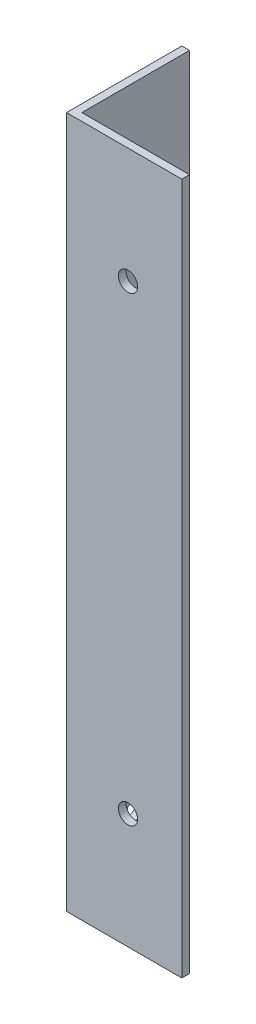
ISO-10303-21;
HEADER;
FILE_DESCRIPTION(('STEP AP214'),'2;1');
FILE_NAME('part.step','',(''),(''),'','','');
FILE_SCHEMA(('AUTOMOTIVE_DESIGN { 1 0 10303 214 1 1 1 1 }'));
ENDSEC;
DATA;
#1=APPLICATION_CONTEXT('core data for automotive mechanical design processes');
#2=APPLICATION_PROTOCOL_DEFINITION('international standard','automotive_design',2000,#1);
#3=PRODUCT_CONTEXT('',#1,'mechanical');
#4=PRODUCT('Part','Part','',(#3));
#5=PRODUCT_RELATED_PRODUCT_CATEGORY('part','',(#4));
#6=PRODUCT_DEFINITION_FORMATION('','',#4);
#7=PRODUCT_DEFINITION_CONTEXT('part definition',#1,'design');
#8=PRODUCT_DEFINITION('design','',#6,#7);
#9=PRODUCT_DEFINITION_SHAPE('','',#8);
#10=(LENGTH_UNIT() NAMED_UNIT(*) SI_UNIT(.MILLI.,.METRE.));
#11=(NAMED_UNIT(*) PLANE_ANGLE_UNIT() SI_UNIT($,.RADIAN.));
#12=(NAMED_UNIT(*) SI_UNIT($,.STERADIAN.) SOLID_ANGLE_UNIT());
#13=UNCERTAINTY_MEASURE_WITH_UNIT(LENGTH_MEASURE(1.E-05),#10,'distance_accuracy_value','');
#14=(GEOMETRIC_REPRESENTATION_CONTEXT(3) GLOBAL_UNCERTAINTY_ASSIGNED_CONTEXT((#13)) GLOBAL_UNIT_ASSIGNED_CONTEXT((#10,
#11,#12)) REPRESENTATION_CONTEXT('',''));
#15=CARTESIAN_POINT('',(0.,0.,0.));
#16=DIRECTION('',(0.,0.,1.));
#17=DIRECTION('',(1.,0.,0.));
#18=AXIS2_PLACEMENT_3D('',#15,#16,#17);
#19=CARTESIAN_POINT('',(0.,90.,0.));
#20=DIRECTION('',(0.,0.,1.));
#21=DIRECTION('',(1.,0.,0.));
#22=AXIS2_PLACEMENT_3D('',#19,#20,#21);
#23=PLANE('',#22);
#24=CARTESIAN_POINT('',(8.,15.,0.));
#25=DIRECTION('',(0.,0.,1.));
#26=DIRECTION('',(1.,0.,0.));
#27=AXIS2_PLACEMENT_3D('',#24,#25,#26);
#28=CIRCLE('',#27,1.24999999999999);
#29=CARTESIAN_POINT('',(9.24999999999999,15.,0.));
#30=VERTEX_POINT('',#29);
#31=EDGE_CURVE('E183',#30,#30,#28,.T.);
#32=ORIENTED_EDGE('',*,*,#31,.T.);
#33=EDGE_LOOP('',(#32));
#34=FACE_BOUND('',#33,.T.);
#35=CARTESIAN_POINT('',(8.,75.,0.));
#36=DIRECTION('',(0.,0.,1.));
#37=DIRECTION('',(1.,0.,0.));
#38=AXIS2_PLACEMENT_3D('',#35,#36,#37);
#39=CIRCLE('',#38,1.24999999999999);
#40=CARTESIAN_POINT('',(9.24999999999999,75.,0.));
#41=VERTEX_POINT('',#40);
#42=EDGE_CURVE('E118',#41,#41,#39,.T.);
#43=ORIENTED_EDGE('',*,*,#42,.T.);
#44=EDGE_LOOP('',(#43));
#45=FACE_BOUND('',#44,.T.);
#46=DIRECTION('',(0.,-1.,0.));
#47=VECTOR('',#46,1.);
#48=CARTESIAN_POINT('',(1.,90.,0.));
#49=LINE('',#48,#47);
#50=CARTESIAN_POINT('',(0.999999999999994,90.,0.));
#51=VERTEX_POINT('',#50);
#52=CARTESIAN_POINT('',(0.999999999999989,0.,0.));
#53=VERTEX_POINT('',#52);
#54=EDGE_CURVE('E49',#51,#53,#49,.T.);
#55=ORIENTED_EDGE('',*,*,#54,.F.);
#56=DIRECTION('',(-1.,0.,0.));
#57=VECTOR('',#56,1.);
#58=CARTESIAN_POINT('',(0.,90.,0.));
#59=LINE('',#58,#57);
#60=CARTESIAN_POINT('',(15.,90.,0.));
#61=VERTEX_POINT('',#60);
#62=EDGE_CURVE('E132',#61,#51,#59,.T.);
#63=ORIENTED_EDGE('',*,*,#62,.F.);
#64=DIRECTION('',(0.,-1.,0.));
#65=VECTOR('',#64,1.);
#66=CARTESIAN_POINT('',(15.,90.,0.));
#67=LINE('',#66,#65);
#68=CARTESIAN_POINT('',(15.,0.,0.));
#69=VERTEX_POINT('',#68);
#70=EDGE_CURVE('E134',#61,#69,#67,.T.);
#71=ORIENTED_EDGE('',*,*,#70,.T.);
#72=DIRECTION('',(-1.,0.,0.));
#73=VECTOR('',#72,1.);
#74=CARTESIAN_POINT('',(0.,0.,0.));
#75=LINE('',#74,#73);
#76=EDGE_CURVE('E102',#69,#53,#75,.T.);
#77=ORIENTED_EDGE('',*,*,#76,.T.);
#78=EDGE_LOOP('',(#55,#63,#71,#77));
#79=FACE_BOUND('',#78,.T.);
#80=ADVANCED_FACE('F34',(#34,#45,#79),#23,.F.);
#81=CARTESIAN_POINT('',(0.,90.,0.));
#82=DIRECTION('',(1.,0.,0.));
#83=DIRECTION('',(0.,0.,-1.));
#84=AXIS2_PLACEMENT_3D('',#81,#82,#83);
#85=PLANE('',#84);
#86=CARTESIAN_POINT('',(0.,8.,-7.));
#87=DIRECTION('',(-1.,0.,0.));
#88=DIRECTION('',(0.,0.,1.));
#89=AXIS2_PLACEMENT_3D('',#86,#87,#88);
#90=CIRCLE('',#89,1.24999999999999);
#91=CARTESIAN_POINT('',(0.,8.,-5.75000000000001));
#92=VERTEX_POINT('',#91);
#93=EDGE_CURVE('E190',#92,#92,#90,.T.);
#94=ORIENTED_EDGE('',*,*,#93,.F.);
#95=EDGE_LOOP('',(#94));
#96=FACE_BOUND('',#95,.T.);
#97=DIRECTION('',(0.,0.,1.));
#98=VECTOR('',#97,1.);
#99=CARTESIAN_POINT('',(0.,0.,0.));
#100=LINE('',#99,#98);
#101=CARTESIAN_POINT('',(0.,0.,-14.));
#102=VERTEX_POINT('',#101);
#103=CARTESIAN_POINT('',(0.,0.,1.));
#104=VERTEX_POINT('',#103);
#105=EDGE_CURVE('E128',#102,#104,#100,.T.);
#106=ORIENTED_EDGE('',*,*,#105,.T.);
#107=DIRECTION('',(0.,-1.,0.));
#108=VECTOR('',#107,1.);
#109=CARTESIAN_POINT('',(0.,90.,1.));
#110=LINE('',#109,#108);
#111=CARTESIAN_POINT('',(0.,90.,1.));
#112=VERTEX_POINT('',#111);
#113=EDGE_CURVE('E11',#112,#104,#110,.T.);
#114=ORIENTED_EDGE('',*,*,#113,.F.);
#115=DIRECTION('',(0.,0.,1.));
#116=VECTOR('',#115,1.);
#117=CARTESIAN_POINT('',(0.,90.,0.));
#118=LINE('',#117,#116);
#119=CARTESIAN_POINT('',(0.,90.,-14.));
#120=VERTEX_POINT('',#119);
#121=EDGE_CURVE('E97',#120,#112,#118,.T.);
#122=ORIENTED_EDGE('',*,*,#121,.F.);
#123=DIRECTION('',(0.,1.,0.));
#124=VECTOR('',#123,1.);
#125=CARTESIAN_POINT('',(0.,90.,-14.));
#126=LINE('',#125,#124);
#127=EDGE_CURVE('E101',#102,#120,#126,.T.);
#128=ORIENTED_EDGE('',*,*,#127,.F.);
#129=EDGE_LOOP('',(#106,#114,#122,#128));
#130=FACE_BOUND('',#129,.T.);
#131=ADVANCED_FACE('F36',(#96,#130),#85,.F.);
#132=CARTESIAN_POINT('',(0.,90.,1.));
#133=DIRECTION('',(0.,0.,-1.));
#134=DIRECTION('',(-1.,0.,0.));
#135=AXIS2_PLACEMENT_3D('',#132,#133,#134);
#136=PLANE('',#135);
#137=CARTESIAN_POINT('',(8.,15.,1.));
#138=DIRECTION('',(0.,0.,1.));
#139=DIRECTION('',(1.,0.,0.));
#140=AXIS2_PLACEMENT_3D('',#137,#138,#139);
#141=CIRCLE('',#140,1.24999999999999);
#142=CARTESIAN_POINT('',(9.24999999999999,15.,1.));
#143=VERTEX_POINT('',#142);
#144=EDGE_CURVE('E178',#143,#143,#141,.T.);
#145=ORIENTED_EDGE('',*,*,#144,.F.);
#146=EDGE_LOOP('',(#145));
#147=FACE_BOUND('',#146,.T.);
#148=CARTESIAN_POINT('',(8.,75.,1.));
#149=DIRECTION('',(0.,0.,1.));
#150=DIRECTION('',(1.,0.,0.));
#151=AXIS2_PLACEMENT_3D('',#148,#149,#150);
#152=CIRCLE('',#151,1.24999999999999);
#153=CARTESIAN_POINT('',(9.24999999999999,75.,1.));
#154=VERTEX_POINT('',#153);
#155=EDGE_CURVE('E181',#154,#154,#152,.T.);
#156=ORIENTED_EDGE('',*,*,#155,.F.);
#157=EDGE_LOOP('',(#156));
#158=FACE_BOUND('',#157,.T.);
#159=DIRECTION('',(1.,0.,0.));
#160=VECTOR('',#159,1.);
#161=CARTESIAN_POINT('',(0.,0.,1.));
#162=LINE('',#161,#160);
#163=CARTESIAN_POINT('',(15.,0.,1.));
#164=VERTEX_POINT('',#163);
#165=EDGE_CURVE('E136',#104,#164,#162,.T.);
#166=ORIENTED_EDGE('',*,*,#165,.T.);
#167=DIRECTION('',(0.,-1.,0.));
#168=VECTOR('',#167,1.);
#169=CARTESIAN_POINT('',(15.,90.,1.));
#170=LINE('',#169,#168);
#171=CARTESIAN_POINT('',(15.,90.,1.));
#172=VERTEX_POINT('',#171);
#173=EDGE_CURVE('E42',#172,#164,#170,.T.);
#174=ORIENTED_EDGE('',*,*,#173,.F.);
#175=DIRECTION('',(1.,0.,0.));
#176=VECTOR('',#175,1.);
#177=CARTESIAN_POINT('',(0.,90.,1.));
#178=LINE('',#177,#176);
#179=EDGE_CURVE('E79',#112,#172,#178,.T.);
#180=ORIENTED_EDGE('',*,*,#179,.F.);
#181=ORIENTED_EDGE('',*,*,#113,.T.);
#182=EDGE_LOOP('',(#166,#174,#180,#181));
#183=FACE_BOUND('',#182,.T.);
#184=ADVANCED_FACE('F165',(#147,#158,#183),#136,.F.);
#185=CARTESIAN_POINT('',(15.,90.,0.));
#186=DIRECTION('',(-1.,0.,0.));
#187=DIRECTION('',(0.,0.,1.));
#188=AXIS2_PLACEMENT_3D('',#185,#186,#187);
#189=PLANE('',#188);
#190=DIRECTION('',(0.,0.,-1.));
#191=VECTOR('',#190,1.);
#192=CARTESIAN_POINT('',(15.,0.,0.));
#193=LINE('',#192,#191);
#194=EDGE_CURVE('E74',#164,#69,#193,.T.);
#195=ORIENTED_EDGE('',*,*,#194,.T.);
#196=ORIENTED_EDGE('',*,*,#70,.F.);
#197=DIRECTION('',(0.,0.,-1.));
#198=VECTOR('',#197,1.);
#199=CARTESIAN_POINT('',(15.,90.,0.));
#200=LINE('',#199,#198);
#201=EDGE_CURVE('E57',#172,#61,#200,.T.);
#202=ORIENTED_EDGE('',*,*,#201,.F.);
#203=ORIENTED_EDGE('',*,*,#173,.T.);
#204=EDGE_LOOP('',(#195,#196,#202,#203));
#205=FACE_BOUND('',#204,.T.);
#206=ADVANCED_FACE('F140',(#205),#189,.F.);
#207=CARTESIAN_POINT('',(0.,90.,0.));
#208=DIRECTION('',(0.,1.,0.));
#209=DIRECTION('',(0.,0.,1.));
#210=AXIS2_PLACEMENT_3D('',#207,#208,#209);
#211=PLANE('',#210);
#212=ORIENTED_EDGE('',*,*,#121,.T.);
#213=ORIENTED_EDGE('',*,*,#179,.T.);
#214=ORIENTED_EDGE('',*,*,#201,.T.);
#215=ORIENTED_EDGE('',*,*,#62,.T.);
#216=DIRECTION('',(0.,0.,1.));
#217=VECTOR('',#216,1.);
#218=CARTESIAN_POINT('',(1.,90.,-14.));
#219=LINE('',#218,#217);
#220=CARTESIAN_POINT('',(1.,90.,-14.));
#221=VERTEX_POINT('',#220);
#222=EDGE_CURVE('E108',#221,#51,#219,.T.);
#223=ORIENTED_EDGE('',*,*,#222,.F.);
#224=DIRECTION('',(1.,0.,0.));
#225=VECTOR('',#224,1.);
#226=CARTESIAN_POINT('',(0.,90.,-14.));
#227=LINE('',#226,#225);
#228=EDGE_CURVE('E105',#120,#221,#227,.T.);
#229=ORIENTED_EDGE('',*,*,#228,.F.);
#230=EDGE_LOOP('',(#212,#213,#214,#215,#223,#229));
#231=FACE_BOUND('',#230,.T.);
#232=ADVANCED_FACE('F106',(#231),#211,.T.);
#233=CARTESIAN_POINT('',(0.,0.,0.));
#234=DIRECTION('',(0.,1.,0.));
#235=DIRECTION('',(0.,0.,1.));
#236=AXIS2_PLACEMENT_3D('',#233,#234,#235);
#237=PLANE('',#236);
#238=ORIENTED_EDGE('',*,*,#105,.F.);
#239=DIRECTION('',(-1.,0.,0.));
#240=VECTOR('',#239,1.);
#241=CARTESIAN_POINT('',(0.,0.,-14.));
#242=LINE('',#241,#240);
#243=CARTESIAN_POINT('',(0.999999999999989,0.,-14.));
#244=VERTEX_POINT('',#243);
#245=EDGE_CURVE('E116',#244,#102,#242,.T.);
#246=ORIENTED_EDGE('',*,*,#245,.F.);
#247=DIRECTION('',(0.,0.,1.));
#248=VECTOR('',#247,1.);
#249=CARTESIAN_POINT('',(0.999999999999989,0.,-14.));
#250=LINE('',#249,#248);
#251=EDGE_CURVE('E124',#244,#53,#250,.T.);
#252=ORIENTED_EDGE('',*,*,#251,.T.);
#253=ORIENTED_EDGE('',*,*,#76,.F.);
#254=ORIENTED_EDGE('',*,*,#194,.F.);
#255=ORIENTED_EDGE('',*,*,#165,.F.);
#256=EDGE_LOOP('',(#238,#246,#252,#253,#254,#255));
#257=FACE_BOUND('',#256,.T.);
#258=ADVANCED_FACE('F143',(#257),#237,.F.);
#259=CARTESIAN_POINT('',(1.,90.,-14.));
#260=DIRECTION('',(-1.,0.,0.));
#261=DIRECTION('',(0.,-1.,0.));
#262=AXIS2_PLACEMENT_3D('',#259,#260,#261);
#263=PLANE('',#262);
#264=CARTESIAN_POINT('',(0.99999999999999,8.,-7.));
#265=DIRECTION('',(-1.,0.,0.));
#266=DIRECTION('',(0.,-1.,0.));
#267=AXIS2_PLACEMENT_3D('',#264,#265,#266);
#268=CIRCLE('',#267,1.24999999999999);
#269=CARTESIAN_POINT('',(0.99999999999999,6.75000000000001,-7.));
#270=VERTEX_POINT('',#269);
#271=EDGE_CURVE('E188',#270,#270,#268,.T.);
#272=ORIENTED_EDGE('',*,*,#271,.T.);
#273=EDGE_LOOP('',(#272));
#274=FACE_BOUND('',#273,.T.);
#275=ORIENTED_EDGE('',*,*,#54,.T.);
#276=ORIENTED_EDGE('',*,*,#251,.F.);
#277=DIRECTION('',(0.,-1.,0.));
#278=VECTOR('',#277,1.);
#279=CARTESIAN_POINT('',(1.,90.,-14.));
#280=LINE('',#279,#278);
#281=EDGE_CURVE('E111',#221,#244,#280,.T.);
#282=ORIENTED_EDGE('',*,*,#281,.F.);
#283=ORIENTED_EDGE('',*,*,#222,.T.);
#284=EDGE_LOOP('',(#275,#276,#282,#283));
#285=FACE_BOUND('',#284,.T.);
#286=ADVANCED_FACE('F146',(#274,#285),#263,.F.);
#287=CARTESIAN_POINT('',(0.,0.,-14.));
#288=DIRECTION('',(0.,0.,1.));
#289=DIRECTION('',(1.,0.,0.));
#290=AXIS2_PLACEMENT_3D('',#287,#288,#289);
#291=PLANE('',#290);
#292=ORIENTED_EDGE('',*,*,#127,.T.);
#293=ORIENTED_EDGE('',*,*,#228,.T.);
#294=ORIENTED_EDGE('',*,*,#281,.T.);
#295=ORIENTED_EDGE('',*,*,#245,.T.);
#296=EDGE_LOOP('',(#292,#293,#294,#295));
#297=FACE_BOUND('',#296,.T.);
#298=ADVANCED_FACE('F114',(#297),#291,.F.);
#299=CARTESIAN_POINT('',(8.,75.,1.));
#300=DIRECTION('',(0.,0.,1.));
#301=DIRECTION('',(1.,0.,0.));
#302=AXIS2_PLACEMENT_3D('',#299,#300,#301);
#303=CYLINDRICAL_SURFACE('',#302,1.24999999999999);
#304=ORIENTED_EDGE('',*,*,#155,.T.);
#305=EDGE_LOOP('',(#304));
#306=FACE_BOUND('',#305,.T.);
#307=ORIENTED_EDGE('',*,*,#42,.F.);
#308=EDGE_LOOP('',(#307));
#309=FACE_BOUND('',#308,.T.);
#310=ADVANCED_FACE('F154',(#306,#309),#303,.F.);
#311=CARTESIAN_POINT('',(8.,15.,1.));
#312=DIRECTION('',(0.,0.,1.));
#313=DIRECTION('',(1.,0.,0.));
#314=AXIS2_PLACEMENT_3D('',#311,#312,#313);
#315=CYLINDRICAL_SURFACE('',#314,1.24999999999999);
#316=ORIENTED_EDGE('',*,*,#144,.T.);
#317=EDGE_LOOP('',(#316));
#318=FACE_BOUND('',#317,.T.);
#319=ORIENTED_EDGE('',*,*,#31,.F.);
#320=EDGE_LOOP('',(#319));
#321=FACE_BOUND('',#320,.T.);
#322=ADVANCED_FACE('F197',(#318,#321),#315,.F.);
#323=CARTESIAN_POINT('',(0.,8.,-7.));
#324=DIRECTION('',(-1.,0.,0.));
#325=DIRECTION('',(0.,0.,1.));
#326=AXIS2_PLACEMENT_3D('',#323,#324,#325);
#327=CYLINDRICAL_SURFACE('',#326,1.24999999999999);
#328=ORIENTED_EDGE('',*,*,#93,.T.);
#329=EDGE_LOOP('',(#328));
#330=FACE_BOUND('',#329,.T.);
#331=ORIENTED_EDGE('',*,*,#271,.F.);
#332=EDGE_LOOP('',(#331));
#333=FACE_BOUND('',#332,.T.);
#334=ADVANCED_FACE('F194',(#330,#333),#327,.F.);
#335=CLOSED_SHELL('',(#80,#131,#184,#206,#232,#258,#286,#298,#310,#322,#334));
#336=MANIFOLD_SOLID_BREP('B2',#335);
#337=ADVANCED_BREP_SHAPE_REPRESENTATION('',(#18,#336),#14);
#338=SHAPE_DEFINITION_REPRESENTATION(#9,#337);
ENDSEC;
END-ISO-10303-21;
